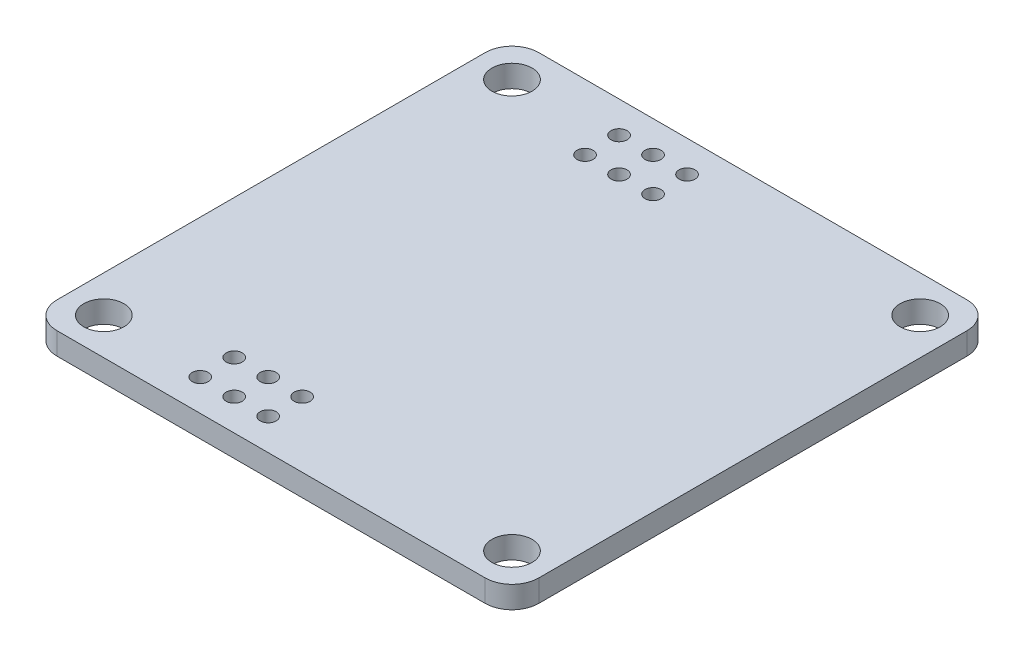
ISO-10303-21;
HEADER;
FILE_DESCRIPTION(('STEP AP214'),'2;1');
FILE_NAME('part.step','',(''),(''),'','','');
FILE_SCHEMA(('AUTOMOTIVE_DESIGN { 1 0 10303 214 1 1 1 1 }'));
ENDSEC;
DATA;
#1=APPLICATION_CONTEXT('core data for automotive mechanical design processes');
#2=APPLICATION_PROTOCOL_DEFINITION('international standard','automotive_design',2000,#1);
#3=PRODUCT_CONTEXT('',#1,'mechanical');
#4=PRODUCT('Part','Part','',(#3));
#5=PRODUCT_RELATED_PRODUCT_CATEGORY('part','',(#4));
#6=PRODUCT_DEFINITION_FORMATION('','',#4);
#7=PRODUCT_DEFINITION_CONTEXT('part definition',#1,'design');
#8=PRODUCT_DEFINITION('design','',#6,#7);
#9=PRODUCT_DEFINITION_SHAPE('','',#8);
#10=(LENGTH_UNIT() NAMED_UNIT(*) SI_UNIT(.MILLI.,.METRE.));
#11=(NAMED_UNIT(*) PLANE_ANGLE_UNIT() SI_UNIT($,.RADIAN.));
#12=(NAMED_UNIT(*) SI_UNIT($,.STERADIAN.) SOLID_ANGLE_UNIT());
#13=UNCERTAINTY_MEASURE_WITH_UNIT(LENGTH_MEASURE(1.E-05),#10,'distance_accuracy_value','');
#14=(GEOMETRIC_REPRESENTATION_CONTEXT(3) GLOBAL_UNCERTAINTY_ASSIGNED_CONTEXT((#13)) GLOBAL_UNIT_ASSIGNED_CONTEXT((#10,
#11,#12)) REPRESENTATION_CONTEXT('',''));
#15=CARTESIAN_POINT('',(0.,0.,0.));
#16=DIRECTION('',(0.,0.,1.));
#17=DIRECTION('',(1.,0.,0.));
#18=AXIS2_PLACEMENT_3D('',#15,#16,#17);
#19=CARTESIAN_POINT('',(0.,1.65,0.));
#20=DIRECTION('',(0.,1.,0.));
#21=DIRECTION('',(0.,0.,1.));
#22=AXIS2_PLACEMENT_3D('',#19,#20,#21);
#23=PLANE('',#22);
#24=CARTESIAN_POINT('',(-7.64999999999998,1.65,-13.11));
#25=DIRECTION('',(0.,1.,0.));
#26=DIRECTION('',(0.,0.,1.));
#27=AXIS2_PLACEMENT_3D('',#24,#25,#26);
#28=CIRCLE('',#27,0.6);
#29=CARTESIAN_POINT('',(-7.64999999999998,1.65,-12.51));
#30=VERTEX_POINT('',#29);
#31=EDGE_CURVE('E263',#30,#30,#28,.T.);
#32=ORIENTED_EDGE('',*,*,#31,.F.);
#33=EDGE_LOOP('',(#32));
#34=FACE_BOUND('',#33,.T.);
#35=CARTESIAN_POINT('',(-2.57000000000001,1.65,15.65));
#36=DIRECTION('',(0.,1.,0.));
#37=DIRECTION('',(0.,0.,-1.));
#38=AXIS2_PLACEMENT_3D('',#35,#36,#37);
#39=CIRCLE('',#38,0.6);
#40=CARTESIAN_POINT('',(-2.57000000000001,1.65,15.05));
#41=VERTEX_POINT('',#40);
#42=EDGE_CURVE('E255',#41,#41,#39,.T.);
#43=ORIENTED_EDGE('',*,*,#42,.F.);
#44=EDGE_LOOP('',(#43));
#45=FACE_BOUND('',#44,.T.);
#46=CARTESIAN_POINT('',(-5.10999999999998,1.65,13.11));
#47=DIRECTION('',(0.,1.,0.));
#48=DIRECTION('',(0.,0.,-1.));
#49=AXIS2_PLACEMENT_3D('',#46,#47,#48);
#50=CIRCLE('',#49,0.6);
#51=CARTESIAN_POINT('',(-5.10999999999998,1.65,12.51));
#52=VERTEX_POINT('',#51);
#53=EDGE_CURVE('E256',#52,#52,#50,.T.);
#54=ORIENTED_EDGE('',*,*,#53,.F.);
#55=EDGE_LOOP('',(#54));
#56=FACE_BOUND('',#55,.T.);
#57=CARTESIAN_POINT('',(-5.11,1.65,15.65));
#58=DIRECTION('',(0.,1.,0.));
#59=DIRECTION('',(0.,0.,-1.));
#60=AXIS2_PLACEMENT_3D('',#57,#58,#59);
#61=CIRCLE('',#60,0.6);
#62=CARTESIAN_POINT('',(-5.11,1.65,15.05));
#63=VERTEX_POINT('',#62);
#64=EDGE_CURVE('E280',#63,#63,#61,.T.);
#65=ORIENTED_EDGE('',*,*,#64,.F.);
#66=EDGE_LOOP('',(#65));
#67=FACE_BOUND('',#66,.T.);
#68=CARTESIAN_POINT('',(-7.64999999999998,1.65,13.11));
#69=DIRECTION('',(0.,1.,0.));
#70=DIRECTION('',(0.,0.,-1.));
#71=AXIS2_PLACEMENT_3D('',#68,#69,#70);
#72=CIRCLE('',#71,0.6);
#73=CARTESIAN_POINT('',(-7.64999999999998,1.65,12.51));
#74=VERTEX_POINT('',#73);
#75=EDGE_CURVE('E273',#74,#74,#72,.T.);
#76=ORIENTED_EDGE('',*,*,#75,.F.);
#77=EDGE_LOOP('',(#76));
#78=FACE_BOUND('',#77,.T.);
#79=CARTESIAN_POINT('',(-7.65000000000001,1.65,15.65));
#80=DIRECTION('',(0.,1.,0.));
#81=DIRECTION('',(0.,0.,-1.));
#82=AXIS2_PLACEMENT_3D('',#79,#80,#81);
#83=CIRCLE('',#82,0.6);
#84=CARTESIAN_POINT('',(-7.65000000000001,1.65,15.05));
#85=VERTEX_POINT('',#84);
#86=EDGE_CURVE('E274',#85,#85,#83,.T.);
#87=ORIENTED_EDGE('',*,*,#86,.F.);
#88=EDGE_LOOP('',(#87));
#89=FACE_BOUND('',#88,.T.);
#90=CARTESIAN_POINT('',(-2.57000000000001,1.65,13.1099999999999));
#91=DIRECTION('',(0.,1.,0.));
#92=DIRECTION('',(0.,0.,-1.));
#93=AXIS2_PLACEMENT_3D('',#90,#91,#92);
#94=CIRCLE('',#93,0.6);
#95=CARTESIAN_POINT('',(-2.57000000000001,1.65,12.5099999999999));
#96=VERTEX_POINT('',#95);
#97=EDGE_CURVE('E225',#96,#96,#94,.T.);
#98=ORIENTED_EDGE('',*,*,#97,.F.);
#99=EDGE_LOOP('',(#98));
#100=FACE_BOUND('',#99,.T.);
#101=CARTESIAN_POINT('',(-5.11,1.65,-15.65));
#102=DIRECTION('',(0.,1.,0.));
#103=DIRECTION('',(0.,0.,1.));
#104=AXIS2_PLACEMENT_3D('',#101,#102,#103);
#105=CIRCLE('',#104,0.6);
#106=CARTESIAN_POINT('',(-5.11,1.65,-15.05));
#107=VERTEX_POINT('',#106);
#108=EDGE_CURVE('E226',#107,#107,#105,.T.);
#109=ORIENTED_EDGE('',*,*,#108,.F.);
#110=EDGE_LOOP('',(#109));
#111=FACE_BOUND('',#110,.T.);
#112=CARTESIAN_POINT('',(-2.57000000000001,1.65,-15.65));
#113=DIRECTION('',(0.,1.,0.));
#114=DIRECTION('',(0.,0.,1.));
#115=AXIS2_PLACEMENT_3D('',#112,#113,#114);
#116=CIRCLE('',#115,0.6);
#117=CARTESIAN_POINT('',(-2.57000000000001,1.65,-15.05));
#118=VERTEX_POINT('',#117);
#119=EDGE_CURVE('E245',#118,#118,#116,.T.);
#120=ORIENTED_EDGE('',*,*,#119,.F.);
#121=EDGE_LOOP('',(#120));
#122=FACE_BOUND('',#121,.T.);
#123=CARTESIAN_POINT('',(-5.10999999999998,1.65,-13.11));
#124=DIRECTION('',(0.,1.,0.));
#125=DIRECTION('',(0.,0.,1.));
#126=AXIS2_PLACEMENT_3D('',#123,#124,#125);
#127=CIRCLE('',#126,0.6);
#128=CARTESIAN_POINT('',(-5.10999999999998,1.65,-12.51));
#129=VERTEX_POINT('',#128);
#130=EDGE_CURVE('E237',#129,#129,#127,.T.);
#131=ORIENTED_EDGE('',*,*,#130,.F.);
#132=EDGE_LOOP('',(#131));
#133=FACE_BOUND('',#132,.T.);
#134=CARTESIAN_POINT('',(-2.57000000000001,1.65,-13.1099999999999));
#135=DIRECTION('',(0.,1.,0.));
#136=DIRECTION('',(0.,0.,1.));
#137=AXIS2_PLACEMENT_3D('',#134,#135,#136);
#138=CIRCLE('',#137,0.6);
#139=CARTESIAN_POINT('',(-2.57000000000001,1.65,-12.5099999999999));
#140=VERTEX_POINT('',#139);
#141=EDGE_CURVE('E238',#140,#140,#138,.T.);
#142=ORIENTED_EDGE('',*,*,#141,.F.);
#143=EDGE_LOOP('',(#142));
#144=FACE_BOUND('',#143,.T.);
#145=CARTESIAN_POINT('',(-7.65000000000001,1.65,-15.65));
#146=DIRECTION('',(0.,1.,0.));
#147=DIRECTION('',(0.,0.,1.));
#148=AXIS2_PLACEMENT_3D('',#145,#146,#147);
#149=CIRCLE('',#148,0.6);
#150=CARTESIAN_POINT('',(-7.65000000000001,1.65,-15.05));
#151=VERTEX_POINT('',#150);
#152=EDGE_CURVE('E218',#151,#151,#149,.T.);
#153=ORIENTED_EDGE('',*,*,#152,.F.);
#154=EDGE_LOOP('',(#153));
#155=FACE_BOUND('',#154,.T.);
#156=CARTESIAN_POINT('',(15.25,1.65,15.25));
#157=DIRECTION('',(0.,1.,0.));
#158=DIRECTION('',(0.,0.,1.));
#159=AXIS2_PLACEMENT_3D('',#156,#157,#158);
#160=CIRCLE('',#159,1.5);
#161=CARTESIAN_POINT('',(15.25,1.65,16.75));
#162=VERTEX_POINT('',#161);
#163=EDGE_CURVE('E201',#162,#162,#160,.T.);
#164=ORIENTED_EDGE('',*,*,#163,.F.);
#165=EDGE_LOOP('',(#164));
#166=FACE_BOUND('',#165,.T.);
#167=CARTESIAN_POINT('',(-15.25,1.65,-15.25));
#168=DIRECTION('',(0.,1.,0.));
#169=DIRECTION('',(0.,0.,1.));
#170=AXIS2_PLACEMENT_3D('',#167,#168,#169);
#171=CIRCLE('',#170,1.5);
#172=CARTESIAN_POINT('',(-15.25,1.65,-13.75));
#173=VERTEX_POINT('',#172);
#174=EDGE_CURVE('E191',#173,#173,#171,.T.);
#175=ORIENTED_EDGE('',*,*,#174,.F.);
#176=EDGE_LOOP('',(#175));
#177=FACE_BOUND('',#176,.T.);
#178=DIRECTION('',(-1.,0.,0.));
#179=VECTOR('',#178,1.);
#180=CARTESIAN_POINT('',(-18.,1.65,-18.));
#181=LINE('',#180,#179);
#182=CARTESIAN_POINT('',(16.,1.65,-18.));
#183=VERTEX_POINT('',#182);
#184=CARTESIAN_POINT('',(-16.,1.65,-18.));
#185=VERTEX_POINT('',#184);
#186=EDGE_CURVE('E182',#183,#185,#181,.T.);
#187=ORIENTED_EDGE('',*,*,#186,.T.);
#188=CARTESIAN_POINT('',(-16.,1.65,-16.));
#189=DIRECTION('',(0.,1.,0.));
#190=DIRECTION('',(0.,0.,1.));
#191=AXIS2_PLACEMENT_3D('',#188,#189,#190);
#192=CIRCLE('',#191,2.);
#193=CARTESIAN_POINT('',(-18.,1.65,-16.));
#194=VERTEX_POINT('',#193);
#195=EDGE_CURVE('E160',#185,#194,#192,.T.);
#196=ORIENTED_EDGE('',*,*,#195,.T.);
#197=DIRECTION('',(0.,0.,1.));
#198=VECTOR('',#197,1.);
#199=CARTESIAN_POINT('',(-18.,1.65,-18.));
#200=LINE('',#199,#198);
#201=CARTESIAN_POINT('',(-18.,1.65,16.));
#202=VERTEX_POINT('',#201);
#203=EDGE_CURVE('E130',#194,#202,#200,.T.);
#204=ORIENTED_EDGE('',*,*,#203,.T.);
#205=CARTESIAN_POINT('',(-16.,1.65,16.));
#206=DIRECTION('',(0.,1.,0.));
#207=DIRECTION('',(0.,0.,1.));
#208=AXIS2_PLACEMENT_3D('',#205,#206,#207);
#209=CIRCLE('',#208,2.);
#210=CARTESIAN_POINT('',(-16.,1.65,18.));
#211=VERTEX_POINT('',#210);
#212=EDGE_CURVE('E66',#202,#211,#209,.T.);
#213=ORIENTED_EDGE('',*,*,#212,.T.);
#214=DIRECTION('',(1.,0.,0.));
#215=VECTOR('',#214,1.);
#216=CARTESIAN_POINT('',(-18.,1.65,18.));
#217=LINE('',#216,#215);
#218=CARTESIAN_POINT('',(16.,1.65,18.));
#219=VERTEX_POINT('',#218);
#220=EDGE_CURVE('E146',#211,#219,#217,.T.);
#221=ORIENTED_EDGE('',*,*,#220,.T.);
#222=CARTESIAN_POINT('',(16.,1.65,16.));
#223=DIRECTION('',(0.,1.,0.));
#224=DIRECTION('',(0.,0.,1.));
#225=AXIS2_PLACEMENT_3D('',#222,#223,#224);
#226=CIRCLE('',#225,2.);
#227=CARTESIAN_POINT('',(18.,1.65,16.));
#228=VERTEX_POINT('',#227);
#229=EDGE_CURVE('E156',#219,#228,#226,.T.);
#230=ORIENTED_EDGE('',*,*,#229,.T.);
#231=DIRECTION('',(0.,0.,-1.));
#232=VECTOR('',#231,1.);
#233=CARTESIAN_POINT('',(18.,1.65,-18.));
#234=LINE('',#233,#232);
#235=CARTESIAN_POINT('',(18.,1.65,-16.));
#236=VERTEX_POINT('',#235);
#237=EDGE_CURVE('E140',#228,#236,#234,.T.);
#238=ORIENTED_EDGE('',*,*,#237,.T.);
#239=CARTESIAN_POINT('',(16.,1.65,-16.));
#240=DIRECTION('',(0.,1.,0.));
#241=DIRECTION('',(0.,0.,1.));
#242=AXIS2_PLACEMENT_3D('',#239,#240,#241);
#243=CIRCLE('',#242,2.);
#244=EDGE_CURVE('E158',#236,#183,#243,.T.);
#245=ORIENTED_EDGE('',*,*,#244,.T.);
#246=EDGE_LOOP('',(#187,#196,#204,#213,#221,#230,#238,#245));
#247=FACE_BOUND('',#246,.T.);
#248=CARTESIAN_POINT('',(15.25,1.65,-15.25));
#249=DIRECTION('',(0.,1.,0.));
#250=DIRECTION('',(0.,0.,-1.));
#251=AXIS2_PLACEMENT_3D('',#248,#249,#250);
#252=CIRCLE('',#251,1.5);
#253=CARTESIAN_POINT('',(15.25,1.65,-16.75));
#254=VERTEX_POINT('',#253);
#255=EDGE_CURVE('E196',#254,#254,#252,.T.);
#256=ORIENTED_EDGE('',*,*,#255,.F.);
#257=EDGE_LOOP('',(#256));
#258=FACE_BOUND('',#257,.T.);
#259=CARTESIAN_POINT('',(-15.25,1.65,15.25));
#260=DIRECTION('',(0.,1.,0.));
#261=DIRECTION('',(0.,0.,-1.));
#262=AXIS2_PLACEMENT_3D('',#259,#260,#261);
#263=CIRCLE('',#262,1.5);
#264=CARTESIAN_POINT('',(-15.25,1.65,13.75));
#265=VERTEX_POINT('',#264);
#266=EDGE_CURVE('E207',#265,#265,#263,.T.);
#267=ORIENTED_EDGE('',*,*,#266,.F.);
#268=EDGE_LOOP('',(#267));
#269=FACE_BOUND('',#268,.T.);
#270=ADVANCED_FACE('F46',(#34,#45,#56,#67,#78,#89,#100,#111,#122,#133,#144,#155,#166,#177,#247,
#258,#269),#23,.T.);
#271=CARTESIAN_POINT('',(0.,0.,0.));
#272=DIRECTION('',(0.,1.,0.));
#273=DIRECTION('',(0.,0.,1.));
#274=AXIS2_PLACEMENT_3D('',#271,#272,#273);
#275=PLANE('',#274);
#276=CARTESIAN_POINT('',(-7.64999999999998,0.,-13.11));
#277=DIRECTION('',(0.,1.,0.));
#278=DIRECTION('',(0.,0.,1.));
#279=AXIS2_PLACEMENT_3D('',#276,#277,#278);
#280=CIRCLE('',#279,0.6);
#281=CARTESIAN_POINT('',(-7.64999999999998,0.,-12.51));
#282=VERTEX_POINT('',#281);
#283=EDGE_CURVE('E241',#282,#282,#280,.F.);
#284=ORIENTED_EDGE('',*,*,#283,.F.);
#285=EDGE_LOOP('',(#284));
#286=FACE_BOUND('',#285,.T.);
#287=CARTESIAN_POINT('',(-2.57000000000001,0.,15.65));
#288=DIRECTION('',(0.,1.,0.));
#289=DIRECTION('',(0.,0.,1.));
#290=AXIS2_PLACEMENT_3D('',#287,#288,#289);
#291=CIRCLE('',#290,0.6);
#292=CARTESIAN_POINT('',(-2.57000000000001,0.,16.25));
#293=VERTEX_POINT('',#292);
#294=EDGE_CURVE('E260',#293,#293,#291,.F.);
#295=ORIENTED_EDGE('',*,*,#294,.F.);
#296=EDGE_LOOP('',(#295));
#297=FACE_BOUND('',#296,.T.);
#298=CARTESIAN_POINT('',(-5.10999999999998,0.,13.11));
#299=DIRECTION('',(0.,1.,0.));
#300=DIRECTION('',(0.,0.,1.));
#301=AXIS2_PLACEMENT_3D('',#298,#299,#300);
#302=CIRCLE('',#301,0.6);
#303=CARTESIAN_POINT('',(-5.10999999999998,0.,13.71));
#304=VERTEX_POINT('',#303);
#305=EDGE_CURVE('E252',#304,#304,#302,.F.);
#306=ORIENTED_EDGE('',*,*,#305,.F.);
#307=EDGE_LOOP('',(#306));
#308=FACE_BOUND('',#307,.T.);
#309=CARTESIAN_POINT('',(-5.11,0.,15.65));
#310=DIRECTION('',(0.,1.,0.));
#311=DIRECTION('',(0.,0.,1.));
#312=AXIS2_PLACEMENT_3D('',#309,#310,#311);
#313=CIRCLE('',#312,0.6);
#314=CARTESIAN_POINT('',(-5.11,0.,16.25));
#315=VERTEX_POINT('',#314);
#316=EDGE_CURVE('E259',#315,#315,#313,.F.);
#317=ORIENTED_EDGE('',*,*,#316,.F.);
#318=EDGE_LOOP('',(#317));
#319=FACE_BOUND('',#318,.T.);
#320=CARTESIAN_POINT('',(-7.64999999999998,0.,13.11));
#321=DIRECTION('',(0.,1.,0.));
#322=DIRECTION('',(0.,0.,1.));
#323=AXIS2_PLACEMENT_3D('',#320,#321,#322);
#324=CIRCLE('',#323,0.6);
#325=CARTESIAN_POINT('',(-7.64999999999998,0.,13.71));
#326=VERTEX_POINT('',#325);
#327=EDGE_CURVE('E277',#326,#326,#324,.F.);
#328=ORIENTED_EDGE('',*,*,#327,.F.);
#329=EDGE_LOOP('',(#328));
#330=FACE_BOUND('',#329,.T.);
#331=CARTESIAN_POINT('',(-7.65000000000001,0.,15.65));
#332=DIRECTION('',(0.,1.,0.));
#333=DIRECTION('',(0.,0.,1.));
#334=AXIS2_PLACEMENT_3D('',#331,#332,#333);
#335=CIRCLE('',#334,0.6);
#336=CARTESIAN_POINT('',(-7.65000000000001,0.,16.25));
#337=VERTEX_POINT('',#336);
#338=EDGE_CURVE('E270',#337,#337,#335,.F.);
#339=ORIENTED_EDGE('',*,*,#338,.F.);
#340=EDGE_LOOP('',(#339));
#341=FACE_BOUND('',#340,.T.);
#342=CARTESIAN_POINT('',(-2.57000000000001,0.,13.1099999999999));
#343=DIRECTION('',(0.,1.,0.));
#344=DIRECTION('',(0.,0.,1.));
#345=AXIS2_PLACEMENT_3D('',#342,#343,#344);
#346=CIRCLE('',#345,0.6);
#347=CARTESIAN_POINT('',(-2.57000000000001,0.,13.7099999999999));
#348=VERTEX_POINT('',#347);
#349=EDGE_CURVE('E221',#348,#348,#346,.F.);
#350=ORIENTED_EDGE('',*,*,#349,.F.);
#351=EDGE_LOOP('',(#350));
#352=FACE_BOUND('',#351,.T.);
#353=CARTESIAN_POINT('',(-5.11,0.,-15.65));
#354=DIRECTION('',(0.,1.,0.));
#355=DIRECTION('',(0.,0.,1.));
#356=AXIS2_PLACEMENT_3D('',#353,#354,#355);
#357=CIRCLE('',#356,0.6);
#358=CARTESIAN_POINT('',(-5.11,0.,-15.05));
#359=VERTEX_POINT('',#358);
#360=EDGE_CURVE('E222',#359,#359,#357,.F.);
#361=ORIENTED_EDGE('',*,*,#360,.F.);
#362=EDGE_LOOP('',(#361));
#363=FACE_BOUND('',#362,.T.);
#364=CARTESIAN_POINT('',(-2.57000000000001,0.,-15.65));
#365=DIRECTION('',(0.,1.,0.));
#366=DIRECTION('',(0.,0.,1.));
#367=AXIS2_PLACEMENT_3D('',#364,#365,#366);
#368=CIRCLE('',#367,0.6);
#369=CARTESIAN_POINT('',(-2.57000000000001,0.,-15.05));
#370=VERTEX_POINT('',#369);
#371=EDGE_CURVE('E229',#370,#370,#368,.F.);
#372=ORIENTED_EDGE('',*,*,#371,.F.);
#373=EDGE_LOOP('',(#372));
#374=FACE_BOUND('',#373,.T.);
#375=CARTESIAN_POINT('',(-5.10999999999998,0.,-13.11));
#376=DIRECTION('',(0.,1.,0.));
#377=DIRECTION('',(0.,0.,1.));
#378=AXIS2_PLACEMENT_3D('',#375,#376,#377);
#379=CIRCLE('',#378,0.6);
#380=CARTESIAN_POINT('',(-5.10999999999998,0.,-12.51));
#381=VERTEX_POINT('',#380);
#382=EDGE_CURVE('E242',#381,#381,#379,.F.);
#383=ORIENTED_EDGE('',*,*,#382,.F.);
#384=EDGE_LOOP('',(#383));
#385=FACE_BOUND('',#384,.T.);
#386=CARTESIAN_POINT('',(-2.57000000000001,0.,-13.1099999999999));
#387=DIRECTION('',(0.,1.,0.));
#388=DIRECTION('',(0.,0.,1.));
#389=AXIS2_PLACEMENT_3D('',#386,#387,#388);
#390=CIRCLE('',#389,0.6);
#391=CARTESIAN_POINT('',(-2.57000000000001,0.,-12.5099999999999));
#392=VERTEX_POINT('',#391);
#393=EDGE_CURVE('E234',#392,#392,#390,.F.);
#394=ORIENTED_EDGE('',*,*,#393,.F.);
#395=EDGE_LOOP('',(#394));
#396=FACE_BOUND('',#395,.T.);
#397=CARTESIAN_POINT('',(-7.65000000000001,0.,-15.65));
#398=DIRECTION('',(0.,1.,0.));
#399=DIRECTION('',(0.,0.,1.));
#400=AXIS2_PLACEMENT_3D('',#397,#398,#399);
#401=CIRCLE('',#400,0.6);
#402=CARTESIAN_POINT('',(-7.65000000000001,0.,-15.05));
#403=VERTEX_POINT('',#402);
#404=EDGE_CURVE('E213',#403,#403,#401,.F.);
#405=ORIENTED_EDGE('',*,*,#404,.F.);
#406=EDGE_LOOP('',(#405));
#407=FACE_BOUND('',#406,.T.);
#408=DIRECTION('',(0.,0.,1.));
#409=VECTOR('',#408,1.);
#410=CARTESIAN_POINT('',(-18.,0.,-18.));
#411=LINE('',#410,#409);
#412=CARTESIAN_POINT('',(-18.,0.,-16.));
#413=VERTEX_POINT('',#412);
#414=CARTESIAN_POINT('',(-18.,0.,16.));
#415=VERTEX_POINT('',#414);
#416=EDGE_CURVE('E128',#413,#415,#411,.T.);
#417=ORIENTED_EDGE('',*,*,#416,.F.);
#418=CARTESIAN_POINT('',(-16.,0.,-16.));
#419=DIRECTION('',(0.,1.,0.));
#420=DIRECTION('',(0.,0.,1.));
#421=AXIS2_PLACEMENT_3D('',#418,#419,#420);
#422=CIRCLE('',#421,2.);
#423=CARTESIAN_POINT('',(-16.,0.,-18.));
#424=VERTEX_POINT('',#423);
#425=EDGE_CURVE('E111',#413,#424,#422,.F.);
#426=ORIENTED_EDGE('',*,*,#425,.T.);
#427=DIRECTION('',(-1.,0.,0.));
#428=VECTOR('',#427,1.);
#429=CARTESIAN_POINT('',(-18.,0.,-18.));
#430=LINE('',#429,#428);
#431=CARTESIAN_POINT('',(16.,0.,-18.));
#432=VERTEX_POINT('',#431);
#433=EDGE_CURVE('E138',#432,#424,#430,.T.);
#434=ORIENTED_EDGE('',*,*,#433,.F.);
#435=CARTESIAN_POINT('',(16.,0.,-16.));
#436=DIRECTION('',(0.,1.,0.));
#437=DIRECTION('',(0.,0.,1.));
#438=AXIS2_PLACEMENT_3D('',#435,#436,#437);
#439=CIRCLE('',#438,2.);
#440=CARTESIAN_POINT('',(18.,0.,-16.));
#441=VERTEX_POINT('',#440);
#442=EDGE_CURVE('E122',#432,#441,#439,.F.);
#443=ORIENTED_EDGE('',*,*,#442,.T.);
#444=DIRECTION('',(0.,0.,-1.));
#445=VECTOR('',#444,1.);
#446=CARTESIAN_POINT('',(18.,0.,-18.));
#447=LINE('',#446,#445);
#448=CARTESIAN_POINT('',(18.,0.,16.));
#449=VERTEX_POINT('',#448);
#450=EDGE_CURVE('E142',#449,#441,#447,.T.);
#451=ORIENTED_EDGE('',*,*,#450,.F.);
#452=CARTESIAN_POINT('',(16.,0.,16.));
#453=DIRECTION('',(0.,1.,0.));
#454=DIRECTION('',(0.,0.,1.));
#455=AXIS2_PLACEMENT_3D('',#452,#453,#454);
#456=CIRCLE('',#455,2.);
#457=CARTESIAN_POINT('',(16.,0.,18.));
#458=VERTEX_POINT('',#457);
#459=EDGE_CURVE('E149',#449,#458,#456,.F.);
#460=ORIENTED_EDGE('',*,*,#459,.T.);
#461=DIRECTION('',(1.,0.,0.));
#462=VECTOR('',#461,1.);
#463=CARTESIAN_POINT('',(-18.,0.,18.));
#464=LINE('',#463,#462);
#465=CARTESIAN_POINT('',(-16.,0.,18.));
#466=VERTEX_POINT('',#465);
#467=EDGE_CURVE('E137',#466,#458,#464,.T.);
#468=ORIENTED_EDGE('',*,*,#467,.F.);
#469=CARTESIAN_POINT('',(-16.,0.,16.));
#470=DIRECTION('',(0.,1.,0.));
#471=DIRECTION('',(0.,0.,1.));
#472=AXIS2_PLACEMENT_3D('',#469,#470,#471);
#473=CIRCLE('',#472,2.);
#474=EDGE_CURVE('E131',#466,#415,#473,.F.);
#475=ORIENTED_EDGE('',*,*,#474,.T.);
#476=EDGE_LOOP('',(#417,#426,#434,#443,#451,#460,#468,#475));
#477=FACE_BOUND('',#476,.T.);
#478=CARTESIAN_POINT('',(-15.25,0.,-15.25));
#479=DIRECTION('',(0.,1.,0.));
#480=DIRECTION('',(0.,0.,1.));
#481=AXIS2_PLACEMENT_3D('',#478,#479,#480);
#482=CIRCLE('',#481,1.5);
#483=CARTESIAN_POINT('',(-15.25,0.,-13.75));
#484=VERTEX_POINT('',#483);
#485=EDGE_CURVE('E187',#484,#484,#482,.T.);
#486=ORIENTED_EDGE('',*,*,#485,.T.);
#487=EDGE_LOOP('',(#486));
#488=FACE_BOUND('',#487,.T.);
#489=CARTESIAN_POINT('',(15.25,0.,-15.25));
#490=DIRECTION('',(0.,1.,0.));
#491=DIRECTION('',(0.,0.,-1.));
#492=AXIS2_PLACEMENT_3D('',#489,#490,#491);
#493=CIRCLE('',#492,1.5);
#494=CARTESIAN_POINT('',(15.25,0.,-16.75));
#495=VERTEX_POINT('',#494);
#496=EDGE_CURVE('E198',#495,#495,#493,.T.);
#497=ORIENTED_EDGE('',*,*,#496,.T.);
#498=EDGE_LOOP('',(#497));
#499=FACE_BOUND('',#498,.T.);
#500=CARTESIAN_POINT('',(15.25,0.,15.25));
#501=DIRECTION('',(0.,1.,0.));
#502=DIRECTION('',(0.,0.,1.));
#503=AXIS2_PLACEMENT_3D('',#500,#501,#502);
#504=CIRCLE('',#503,1.5);
#505=CARTESIAN_POINT('',(15.25,0.,16.75));
#506=VERTEX_POINT('',#505);
#507=EDGE_CURVE('E204',#506,#506,#504,.T.);
#508=ORIENTED_EDGE('',*,*,#507,.T.);
#509=EDGE_LOOP('',(#508));
#510=FACE_BOUND('',#509,.T.);
#511=CARTESIAN_POINT('',(-15.25,0.,15.25));
#512=DIRECTION('',(0.,1.,0.));
#513=DIRECTION('',(0.,0.,-1.));
#514=AXIS2_PLACEMENT_3D('',#511,#512,#513);
#515=CIRCLE('',#514,1.5);
#516=CARTESIAN_POINT('',(-15.25,0.,13.75));
#517=VERTEX_POINT('',#516);
#518=EDGE_CURVE('E210',#517,#517,#515,.T.);
#519=ORIENTED_EDGE('',*,*,#518,.T.);
#520=EDGE_LOOP('',(#519));
#521=FACE_BOUND('',#520,.T.);
#522=ADVANCED_FACE('F134',(#286,#297,#308,#319,#330,#341,#352,#363,#374,#385,#396,#407,#477,
#488,#499,#510,#521),#275,.F.);
#523=CARTESIAN_POINT('',(18.,1.65,-18.));
#524=DIRECTION('',(-1.,0.,0.));
#525=DIRECTION('',(0.,0.,1.));
#526=AXIS2_PLACEMENT_3D('',#523,#524,#525);
#527=PLANE('',#526);
#528=ORIENTED_EDGE('',*,*,#450,.T.);
#529=DIRECTION('',(0.,-1.,0.));
#530=VECTOR('',#529,1.);
#531=CARTESIAN_POINT('',(18.,1.65,-16.));
#532=LINE('',#531,#530);
#533=EDGE_CURVE('E165',#441,#236,#532,.F.);
#534=ORIENTED_EDGE('',*,*,#533,.T.);
#535=ORIENTED_EDGE('',*,*,#237,.F.);
#536=DIRECTION('',(0.,-1.,0.));
#537=VECTOR('',#536,1.);
#538=CARTESIAN_POINT('',(18.,1.65,16.));
#539=LINE('',#538,#537);
#540=EDGE_CURVE('E162',#228,#449,#539,.T.);
#541=ORIENTED_EDGE('',*,*,#540,.T.);
#542=EDGE_LOOP('',(#528,#534,#535,#541));
#543=FACE_BOUND('',#542,.T.);
#544=ADVANCED_FACE('F178',(#543),#527,.F.);
#545=CARTESIAN_POINT('',(-18.,1.65,-18.));
#546=DIRECTION('',(0.,0.,1.));
#547=DIRECTION('',(1.,0.,0.));
#548=AXIS2_PLACEMENT_3D('',#545,#546,#547);
#549=PLANE('',#548);
#550=ORIENTED_EDGE('',*,*,#433,.T.);
#551=DIRECTION('',(0.,-1.,0.));
#552=VECTOR('',#551,1.);
#553=CARTESIAN_POINT('',(-16.,1.65,-18.));
#554=LINE('',#553,#552);
#555=EDGE_CURVE('E116',#424,#185,#554,.F.);
#556=ORIENTED_EDGE('',*,*,#555,.T.);
#557=ORIENTED_EDGE('',*,*,#186,.F.);
#558=DIRECTION('',(0.,-1.,0.));
#559=VECTOR('',#558,1.);
#560=CARTESIAN_POINT('',(16.,1.65,-18.));
#561=LINE('',#560,#559);
#562=EDGE_CURVE('E121',#183,#432,#561,.T.);
#563=ORIENTED_EDGE('',*,*,#562,.T.);
#564=EDGE_LOOP('',(#550,#556,#557,#563));
#565=FACE_BOUND('',#564,.T.);
#566=ADVANCED_FACE('F332',(#565),#549,.F.);
#567=CARTESIAN_POINT('',(-18.,1.65,-18.));
#568=DIRECTION('',(1.,0.,0.));
#569=DIRECTION('',(0.,0.,-1.));
#570=AXIS2_PLACEMENT_3D('',#567,#568,#569);
#571=PLANE('',#570);
#572=ORIENTED_EDGE('',*,*,#203,.F.);
#573=DIRECTION('',(0.,-1.,0.));
#574=VECTOR('',#573,1.);
#575=CARTESIAN_POINT('',(-18.,1.65,-16.));
#576=LINE('',#575,#574);
#577=EDGE_CURVE('E115',#194,#413,#576,.T.);
#578=ORIENTED_EDGE('',*,*,#577,.T.);
#579=ORIENTED_EDGE('',*,*,#416,.T.);
#580=DIRECTION('',(0.,-1.,0.));
#581=VECTOR('',#580,1.);
#582=CARTESIAN_POINT('',(-18.,1.65,16.));
#583=LINE('',#582,#581);
#584=EDGE_CURVE('E132',#415,#202,#583,.F.);
#585=ORIENTED_EDGE('',*,*,#584,.T.);
#586=EDGE_LOOP('',(#572,#578,#579,#585));
#587=FACE_BOUND('',#586,.T.);
#588=ADVANCED_FACE('F127',(#587),#571,.F.);
#589=CARTESIAN_POINT('',(-18.,1.65,18.));
#590=DIRECTION('',(0.,0.,-1.));
#591=DIRECTION('',(-1.,0.,0.));
#592=AXIS2_PLACEMENT_3D('',#589,#590,#591);
#593=PLANE('',#592);
#594=ORIENTED_EDGE('',*,*,#467,.T.);
#595=DIRECTION('',(0.,-1.,0.));
#596=VECTOR('',#595,1.);
#597=CARTESIAN_POINT('',(16.,1.65,18.));
#598=LINE('',#597,#596);
#599=EDGE_CURVE('E13',#458,#219,#598,.F.);
#600=ORIENTED_EDGE('',*,*,#599,.T.);
#601=ORIENTED_EDGE('',*,*,#220,.F.);
#602=DIRECTION('',(0.,-1.,0.));
#603=VECTOR('',#602,1.);
#604=CARTESIAN_POINT('',(-16.,1.65,18.));
#605=LINE('',#604,#603);
#606=EDGE_CURVE('E54',#211,#466,#605,.T.);
#607=ORIENTED_EDGE('',*,*,#606,.T.);
#608=EDGE_LOOP('',(#594,#600,#601,#607));
#609=FACE_BOUND('',#608,.T.);
#610=ADVANCED_FACE('F168',(#609),#593,.F.);
#611=CARTESIAN_POINT('',(-15.25,1.65,-15.25));
#612=DIRECTION('',(0.,-1.,0.));
#613=DIRECTION('',(0.,0.,-1.));
#614=AXIS2_PLACEMENT_3D('',#611,#612,#613);
#615=CYLINDRICAL_SURFACE('',#614,1.5);
#616=ORIENTED_EDGE('',*,*,#174,.T.);
#617=EDGE_LOOP('',(#616));
#618=FACE_BOUND('',#617,.T.);
#619=ORIENTED_EDGE('',*,*,#485,.F.);
#620=EDGE_LOOP('',(#619));
#621=FACE_BOUND('',#620,.T.);
#622=ADVANCED_FACE('F340',(#618,#621),#615,.F.);
#623=CARTESIAN_POINT('',(15.25,1.65,-15.25));
#624=DIRECTION('',(0.,-1.,0.));
#625=DIRECTION('',(0.,0.,-1.));
#626=AXIS2_PLACEMENT_3D('',#623,#624,#625);
#627=CYLINDRICAL_SURFACE('',#626,1.5);
#628=ORIENTED_EDGE('',*,*,#255,.T.);
#629=EDGE_LOOP('',(#628));
#630=FACE_BOUND('',#629,.T.);
#631=ORIENTED_EDGE('',*,*,#496,.F.);
#632=EDGE_LOOP('',(#631));
#633=FACE_BOUND('',#632,.T.);
#634=ADVANCED_FACE('F375',(#630,#633),#627,.F.);
#635=CARTESIAN_POINT('',(15.25,1.65,15.25));
#636=DIRECTION('',(0.,-1.,0.));
#637=DIRECTION('',(0.,0.,-1.));
#638=AXIS2_PLACEMENT_3D('',#635,#636,#637);
#639=CYLINDRICAL_SURFACE('',#638,1.5);
#640=ORIENTED_EDGE('',*,*,#163,.T.);
#641=EDGE_LOOP('',(#640));
#642=FACE_BOUND('',#641,.T.);
#643=ORIENTED_EDGE('',*,*,#507,.F.);
#644=EDGE_LOOP('',(#643));
#645=FACE_BOUND('',#644,.T.);
#646=ADVANCED_FACE('F322',(#642,#645),#639,.F.);
#647=CARTESIAN_POINT('',(-15.25,1.65,15.25));
#648=DIRECTION('',(0.,-1.,0.));
#649=DIRECTION('',(0.,0.,-1.));
#650=AXIS2_PLACEMENT_3D('',#647,#648,#649);
#651=CYLINDRICAL_SURFACE('',#650,1.5);
#652=ORIENTED_EDGE('',*,*,#266,.T.);
#653=EDGE_LOOP('',(#652));
#654=FACE_BOUND('',#653,.T.);
#655=ORIENTED_EDGE('',*,*,#518,.F.);
#656=EDGE_LOOP('',(#655));
#657=FACE_BOUND('',#656,.T.);
#658=ADVANCED_FACE('F319',(#654,#657),#651,.F.);
#659=CARTESIAN_POINT('',(-16.,1.65,-16.));
#660=DIRECTION('',(0.,-1.,0.));
#661=DIRECTION('',(0.,0.,-1.));
#662=AXIS2_PLACEMENT_3D('',#659,#660,#661);
#663=CYLINDRICAL_SURFACE('',#662,2.);
#664=ORIENTED_EDGE('',*,*,#195,.F.);
#665=ORIENTED_EDGE('',*,*,#555,.F.);
#666=ORIENTED_EDGE('',*,*,#425,.F.);
#667=ORIENTED_EDGE('',*,*,#577,.F.);
#668=EDGE_LOOP('',(#664,#665,#666,#667));
#669=FACE_BOUND('',#668,.T.);
#670=ADVANCED_FACE('F114',(#669),#663,.T.);
#671=CARTESIAN_POINT('',(16.,1.65,-16.));
#672=DIRECTION('',(0.,-1.,0.));
#673=DIRECTION('',(0.,0.,-1.));
#674=AXIS2_PLACEMENT_3D('',#671,#672,#673);
#675=CYLINDRICAL_SURFACE('',#674,2.);
#676=ORIENTED_EDGE('',*,*,#244,.F.);
#677=ORIENTED_EDGE('',*,*,#533,.F.);
#678=ORIENTED_EDGE('',*,*,#442,.F.);
#679=ORIENTED_EDGE('',*,*,#562,.F.);
#680=EDGE_LOOP('',(#676,#677,#678,#679));
#681=FACE_BOUND('',#680,.T.);
#682=ADVANCED_FACE('F348',(#681),#675,.T.);
#683=CARTESIAN_POINT('',(16.,1.65,16.));
#684=DIRECTION('',(0.,-1.,0.));
#685=DIRECTION('',(0.,0.,-1.));
#686=AXIS2_PLACEMENT_3D('',#683,#684,#685);
#687=CYLINDRICAL_SURFACE('',#686,2.);
#688=ORIENTED_EDGE('',*,*,#229,.F.);
#689=ORIENTED_EDGE('',*,*,#599,.F.);
#690=ORIENTED_EDGE('',*,*,#459,.F.);
#691=ORIENTED_EDGE('',*,*,#540,.F.);
#692=EDGE_LOOP('',(#688,#689,#690,#691));
#693=FACE_BOUND('',#692,.T.);
#694=ADVANCED_FACE('F175',(#693),#687,.T.);
#695=CARTESIAN_POINT('',(-16.,1.65,16.));
#696=DIRECTION('',(0.,-1.,0.));
#697=DIRECTION('',(0.,0.,-1.));
#698=AXIS2_PLACEMENT_3D('',#695,#696,#697);
#699=CYLINDRICAL_SURFACE('',#698,2.);
#700=ORIENTED_EDGE('',*,*,#212,.F.);
#701=ORIENTED_EDGE('',*,*,#584,.F.);
#702=ORIENTED_EDGE('',*,*,#474,.F.);
#703=ORIENTED_EDGE('',*,*,#606,.F.);
#704=EDGE_LOOP('',(#700,#701,#702,#703));
#705=FACE_BOUND('',#704,.T.);
#706=ADVANCED_FACE('F48',(#705),#699,.T.);
#707=CARTESIAN_POINT('',(-7.65000000000001,-0.000999999999999916,-15.65));
#708=DIRECTION('',(0.,1.,0.));
#709=DIRECTION('',(0.,0.,1.));
#710=AXIS2_PLACEMENT_3D('',#707,#708,#709);
#711=CYLINDRICAL_SURFACE('',#710,0.6);
#712=ORIENTED_EDGE('',*,*,#152,.T.);
#713=EDGE_LOOP('',(#712));
#714=FACE_BOUND('',#713,.T.);
#715=ORIENTED_EDGE('',*,*,#404,.T.);
#716=EDGE_LOOP('',(#715));
#717=FACE_BOUND('',#716,.T.);
#718=ADVANCED_FACE('F355',(#714,#717),#711,.F.);
#719=CARTESIAN_POINT('',(-2.57000000000001,-0.000999999999999916,-13.1099999999999));
#720=DIRECTION('',(0.,1.,0.));
#721=DIRECTION('',(0.,0.,1.));
#722=AXIS2_PLACEMENT_3D('',#719,#720,#721);
#723=CYLINDRICAL_SURFACE('',#722,0.6);
#724=ORIENTED_EDGE('',*,*,#141,.T.);
#725=EDGE_LOOP('',(#724));
#726=FACE_BOUND('',#725,.T.);
#727=ORIENTED_EDGE('',*,*,#393,.T.);
#728=EDGE_LOOP('',(#727));
#729=FACE_BOUND('',#728,.T.);
#730=ADVANCED_FACE('F359',(#726,#729),#723,.F.);
#731=CARTESIAN_POINT('',(-5.10999999999998,-0.000999999999999916,-13.11));
#732=DIRECTION('',(0.,1.,0.));
#733=DIRECTION('',(0.,0.,1.));
#734=AXIS2_PLACEMENT_3D('',#731,#732,#733);
#735=CYLINDRICAL_SURFACE('',#734,0.6);
#736=ORIENTED_EDGE('',*,*,#130,.T.);
#737=EDGE_LOOP('',(#736));
#738=FACE_BOUND('',#737,.T.);
#739=ORIENTED_EDGE('',*,*,#382,.T.);
#740=EDGE_LOOP('',(#739));
#741=FACE_BOUND('',#740,.T.);
#742=ADVANCED_FACE('F365',(#738,#741),#735,.F.);
#743=CARTESIAN_POINT('',(-2.57000000000001,-0.000999999999999916,-15.65));
#744=DIRECTION('',(0.,1.,0.));
#745=DIRECTION('',(0.,0.,1.));
#746=AXIS2_PLACEMENT_3D('',#743,#744,#745);
#747=CYLINDRICAL_SURFACE('',#746,0.6);
#748=ORIENTED_EDGE('',*,*,#119,.T.);
#749=EDGE_LOOP('',(#748));
#750=FACE_BOUND('',#749,.T.);
#751=ORIENTED_EDGE('',*,*,#371,.T.);
#752=EDGE_LOOP('',(#751));
#753=FACE_BOUND('',#752,.T.);
#754=ADVANCED_FACE('F454',(#750,#753),#747,.F.);
#755=CARTESIAN_POINT('',(-5.11,-0.000999999999999916,-15.65));
#756=DIRECTION('',(0.,1.,0.));
#757=DIRECTION('',(0.,0.,1.));
#758=AXIS2_PLACEMENT_3D('',#755,#756,#757);
#759=CYLINDRICAL_SURFACE('',#758,0.6);
#760=ORIENTED_EDGE('',*,*,#108,.T.);
#761=EDGE_LOOP('',(#760));
#762=FACE_BOUND('',#761,.T.);
#763=ORIENTED_EDGE('',*,*,#360,.T.);
#764=EDGE_LOOP('',(#763));
#765=FACE_BOUND('',#764,.T.);
#766=ADVANCED_FACE('F370',(#762,#765),#759,.F.);
#767=CARTESIAN_POINT('',(-2.57000000000001,-0.000999999999999916,13.1099999999999));
#768=DIRECTION('',(0.,1.,0.));
#769=DIRECTION('',(0.,0.,1.));
#770=AXIS2_PLACEMENT_3D('',#767,#768,#769);
#771=CYLINDRICAL_SURFACE('',#770,0.6);
#772=ORIENTED_EDGE('',*,*,#97,.T.);
#773=EDGE_LOOP('',(#772));
#774=FACE_BOUND('',#773,.T.);
#775=ORIENTED_EDGE('',*,*,#349,.T.);
#776=EDGE_LOOP('',(#775));
#777=FACE_BOUND('',#776,.T.);
#778=ADVANCED_FACE('F473',(#774,#777),#771,.F.);
#779=CARTESIAN_POINT('',(-7.65000000000001,-0.000999999999999916,15.65));
#780=DIRECTION('',(0.,1.,0.));
#781=DIRECTION('',(0.,0.,1.));
#782=AXIS2_PLACEMENT_3D('',#779,#780,#781);
#783=CYLINDRICAL_SURFACE('',#782,0.6);
#784=ORIENTED_EDGE('',*,*,#86,.T.);
#785=EDGE_LOOP('',(#784));
#786=FACE_BOUND('',#785,.T.);
#787=ORIENTED_EDGE('',*,*,#338,.T.);
#788=EDGE_LOOP('',(#787));
#789=FACE_BOUND('',#788,.T.);
#790=ADVANCED_FACE('F482',(#786,#789),#783,.F.);
#791=CARTESIAN_POINT('',(-7.64999999999998,-0.000999999999999916,13.11));
#792=DIRECTION('',(0.,1.,0.));
#793=DIRECTION('',(0.,0.,1.));
#794=AXIS2_PLACEMENT_3D('',#791,#792,#793);
#795=CYLINDRICAL_SURFACE('',#794,0.6);
#796=ORIENTED_EDGE('',*,*,#75,.T.);
#797=EDGE_LOOP('',(#796));
#798=FACE_BOUND('',#797,.T.);
#799=ORIENTED_EDGE('',*,*,#327,.T.);
#800=EDGE_LOOP('',(#799));
#801=FACE_BOUND('',#800,.T.);
#802=ADVANCED_FACE('F491',(#798,#801),#795,.F.);
#803=CARTESIAN_POINT('',(-5.11,-0.000999999999999916,15.65));
#804=DIRECTION('',(0.,1.,0.));
#805=DIRECTION('',(0.,0.,1.));
#806=AXIS2_PLACEMENT_3D('',#803,#804,#805);
#807=CYLINDRICAL_SURFACE('',#806,0.6);
#808=ORIENTED_EDGE('',*,*,#64,.T.);
#809=EDGE_LOOP('',(#808));
#810=FACE_BOUND('',#809,.T.);
#811=ORIENTED_EDGE('',*,*,#316,.T.);
#812=EDGE_LOOP('',(#811));
#813=FACE_BOUND('',#812,.T.);
#814=ADVANCED_FACE('F288',(#810,#813),#807,.F.);
#815=CARTESIAN_POINT('',(-5.10999999999998,-0.000999999999999916,13.11));
#816=DIRECTION('',(0.,1.,0.));
#817=DIRECTION('',(0.,0.,1.));
#818=AXIS2_PLACEMENT_3D('',#815,#816,#817);
#819=CYLINDRICAL_SURFACE('',#818,0.6);
#820=ORIENTED_EDGE('',*,*,#53,.T.);
#821=EDGE_LOOP('',(#820));
#822=FACE_BOUND('',#821,.T.);
#823=ORIENTED_EDGE('',*,*,#305,.T.);
#824=EDGE_LOOP('',(#823));
#825=FACE_BOUND('',#824,.T.);
#826=ADVANCED_FACE('F510',(#822,#825),#819,.F.);
#827=CARTESIAN_POINT('',(-2.57000000000001,-0.000999999999999916,15.65));
#828=DIRECTION('',(0.,1.,0.));
#829=DIRECTION('',(0.,0.,1.));
#830=AXIS2_PLACEMENT_3D('',#827,#828,#829);
#831=CYLINDRICAL_SURFACE('',#830,0.6);
#832=ORIENTED_EDGE('',*,*,#42,.T.);
#833=EDGE_LOOP('',(#832));
#834=FACE_BOUND('',#833,.T.);
#835=ORIENTED_EDGE('',*,*,#294,.T.);
#836=EDGE_LOOP('',(#835));
#837=FACE_BOUND('',#836,.T.);
#838=ADVANCED_FACE('F519',(#834,#837),#831,.F.);
#839=CARTESIAN_POINT('',(-7.64999999999998,-0.000999999999999916,-13.11));
#840=DIRECTION('',(0.,1.,0.));
#841=DIRECTION('',(0.,0.,1.));
#842=AXIS2_PLACEMENT_3D('',#839,#840,#841);
#843=CYLINDRICAL_SURFACE('',#842,0.6);
#844=ORIENTED_EDGE('',*,*,#31,.T.);
#845=EDGE_LOOP('',(#844));
#846=FACE_BOUND('',#845,.T.);
#847=ORIENTED_EDGE('',*,*,#283,.T.);
#848=EDGE_LOOP('',(#847));
#849=FACE_BOUND('',#848,.T.);
#850=ADVANCED_FACE('F529',(#846,#849),#843,.F.);
#851=CLOSED_SHELL('',(#270,#522,#544,#566,#588,#610,#622,#634,#646,#658,#670,#682,#694,#706,
#718,#730,#742,#754,#766,#778,#790,#802,#814,#826,#838,#850));
#852=MANIFOLD_SOLID_BREP('B2',#851);
#853=ADVANCED_BREP_SHAPE_REPRESENTATION('',(#18,#852),#14);
#854=SHAPE_DEFINITION_REPRESENTATION(#9,#853);
ENDSEC;
END-ISO-10303-21;
